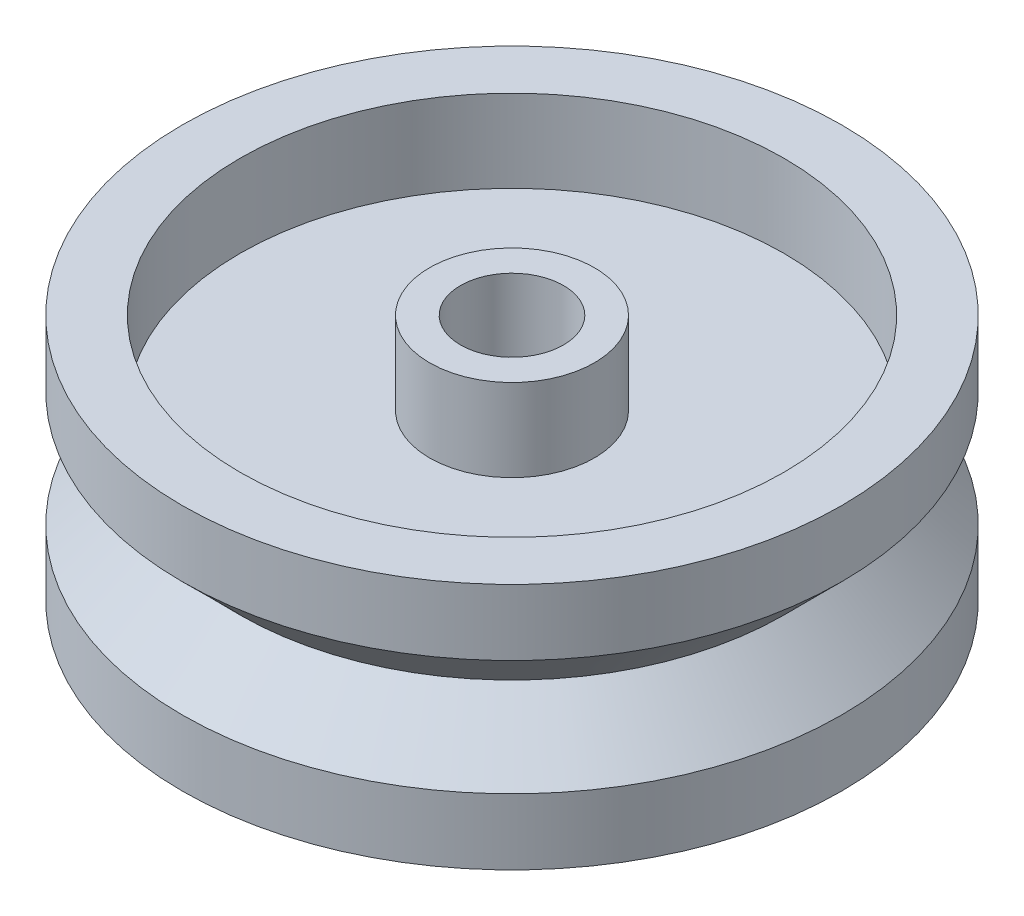
ISO-10303-21;
HEADER;
FILE_DESCRIPTION(('STEP AP214'),'2;1');
FILE_NAME('part.step','',(''),(''),'','','');
FILE_SCHEMA(('AUTOMOTIVE_DESIGN { 1 0 10303 214 1 1 1 1 }'));
ENDSEC;
DATA;
#1=APPLICATION_CONTEXT('core data for automotive mechanical design processes');
#2=APPLICATION_PROTOCOL_DEFINITION('international standard','automotive_design',2000,#1);
#3=PRODUCT_CONTEXT('',#1,'mechanical');
#4=PRODUCT('Part','Part','',(#3));
#5=PRODUCT_RELATED_PRODUCT_CATEGORY('part','',(#4));
#6=PRODUCT_DEFINITION_FORMATION('','',#4);
#7=PRODUCT_DEFINITION_CONTEXT('part definition',#1,'design');
#8=PRODUCT_DEFINITION('design','',#6,#7);
#9=PRODUCT_DEFINITION_SHAPE('','',#8);
#10=(LENGTH_UNIT() NAMED_UNIT(*) SI_UNIT(.MILLI.,.METRE.));
#11=(NAMED_UNIT(*) PLANE_ANGLE_UNIT() SI_UNIT($,.RADIAN.));
#12=(NAMED_UNIT(*) SI_UNIT($,.STERADIAN.) SOLID_ANGLE_UNIT());
#13=UNCERTAINTY_MEASURE_WITH_UNIT(LENGTH_MEASURE(1.E-05),#10,'distance_accuracy_value','');
#14=(GEOMETRIC_REPRESENTATION_CONTEXT(3) GLOBAL_UNCERTAINTY_ASSIGNED_CONTEXT((#13)) GLOBAL_UNIT_ASSIGNED_CONTEXT((#10,
#11,#12)) REPRESENTATION_CONTEXT('',''));
#15=CARTESIAN_POINT('',(0.,0.,0.));
#16=DIRECTION('',(0.,0.,1.));
#17=DIRECTION('',(1.,0.,0.));
#18=AXIS2_PLACEMENT_3D('',#15,#16,#17);
#19=CARTESIAN_POINT('',(0.,-7.5,0.));
#20=DIRECTION('',(0.,1.,0.));
#21=DIRECTION('',(0.,0.,1.));
#22=AXIS2_PLACEMENT_3D('',#19,#20,#21);
#23=CYLINDRICAL_SURFACE('',#22,20.);
#24=CARTESIAN_POINT('',(0.,7.5,0.));
#25=DIRECTION('',(0.,1.,0.));
#26=DIRECTION('',(0.,0.,1.));
#27=AXIS2_PLACEMENT_3D('',#24,#25,#26);
#28=CIRCLE('',#27,20.);
#29=CARTESIAN_POINT('',(0.,7.5,20.));
#30=VERTEX_POINT('',#29);
#31=EDGE_CURVE('E64',#30,#30,#28,.T.);
#32=ORIENTED_EDGE('',*,*,#31,.F.);
#33=EDGE_LOOP('',(#32));
#34=FACE_BOUND('',#33,.T.);
#35=CARTESIAN_POINT('',(0.,3.5,0.));
#36=DIRECTION('',(0.,-1.,0.));
#37=DIRECTION('',(0.,0.,-1.));
#38=AXIS2_PLACEMENT_3D('',#35,#36,#37);
#39=CIRCLE('',#38,20.);
#40=CARTESIAN_POINT('',(0.,3.5,-20.));
#41=VERTEX_POINT('',#40);
#42=EDGE_CURVE('E93',#41,#41,#39,.T.);
#43=ORIENTED_EDGE('',*,*,#42,.F.);
#44=EDGE_LOOP('',(#43));
#45=FACE_BOUND('',#44,.T.);
#46=ADVANCED_FACE('F49',(#34,#45),#23,.T.);
#47=CARTESIAN_POINT('',(0.,-7.5,0.));
#48=DIRECTION('',(0.,1.,0.));
#49=DIRECTION('',(0.,0.,1.));
#50=AXIS2_PLACEMENT_3D('',#47,#48,#49);
#51=CIRCLE('',#50,20.);
#52=CARTESIAN_POINT('',(0.,-7.5,20.));
#53=VERTEX_POINT('',#52);
#54=EDGE_CURVE('E56',#53,#53,#51,.T.);
#55=ORIENTED_EDGE('',*,*,#54,.T.);
#56=EDGE_LOOP('',(#55));
#57=FACE_BOUND('',#56,.T.);
#58=CARTESIAN_POINT('',(0.,-3.5,0.));
#59=DIRECTION('',(0.,-1.,0.));
#60=DIRECTION('',(0.,0.,-1.));
#61=AXIS2_PLACEMENT_3D('',#58,#59,#60);
#62=CIRCLE('',#61,20.);
#63=CARTESIAN_POINT('',(0.,-3.5,-20.));
#64=VERTEX_POINT('',#63);
#65=EDGE_CURVE('E99',#64,#64,#62,.T.);
#66=ORIENTED_EDGE('',*,*,#65,.T.);
#67=EDGE_LOOP('',(#66));
#68=FACE_BOUND('',#67,.T.);
#69=ADVANCED_FACE('F103',(#57,#68),#23,.T.);
#70=CARTESIAN_POINT('',(0.,-7.5,0.));
#71=DIRECTION('',(0.,1.,0.));
#72=DIRECTION('',(0.,0.,1.));
#73=AXIS2_PLACEMENT_3D('',#70,#71,#72);
#74=CYLINDRICAL_SURFACE('',#73,16.5);
#75=CARTESIAN_POINT('',(0.,-7.5,0.));
#76=DIRECTION('',(0.,1.,0.));
#77=DIRECTION('',(0.,0.,1.));
#78=AXIS2_PLACEMENT_3D('',#75,#76,#77);
#79=CIRCLE('',#78,16.5);
#80=CARTESIAN_POINT('',(0.,-7.5,16.5));
#81=VERTEX_POINT('',#80);
#82=EDGE_CURVE('E60',#81,#81,#79,.T.);
#83=ORIENTED_EDGE('',*,*,#82,.F.);
#84=EDGE_LOOP('',(#83));
#85=FACE_BOUND('',#84,.T.);
#86=CARTESIAN_POINT('',(0.,-2.5,0.));
#87=DIRECTION('',(0.,1.,0.));
#88=DIRECTION('',(0.,0.,1.));
#89=AXIS2_PLACEMENT_3D('',#86,#87,#88);
#90=CIRCLE('',#89,16.5);
#91=CARTESIAN_POINT('',(0.,-2.5,16.5));
#92=VERTEX_POINT('',#91);
#93=EDGE_CURVE('E11',#92,#92,#90,.F.);
#94=ORIENTED_EDGE('',*,*,#93,.F.);
#95=EDGE_LOOP('',(#94));
#96=FACE_BOUND('',#95,.T.);
#97=ADVANCED_FACE('F122',(#85,#96),#74,.F.);
#98=CARTESIAN_POINT('',(0.,2.5,0.));
#99=DIRECTION('',(0.,1.,0.));
#100=DIRECTION('',(0.,0.,1.));
#101=AXIS2_PLACEMENT_3D('',#98,#99,#100);
#102=CIRCLE('',#101,16.5);
#103=CARTESIAN_POINT('',(0.,2.5,16.5));
#104=VERTEX_POINT('',#103);
#105=EDGE_CURVE('E72',#104,#104,#102,.T.);
#106=ORIENTED_EDGE('',*,*,#105,.F.);
#107=EDGE_LOOP('',(#106));
#108=FACE_BOUND('',#107,.T.);
#109=CARTESIAN_POINT('',(0.,7.5,0.));
#110=DIRECTION('',(0.,1.,0.));
#111=DIRECTION('',(0.,0.,1.));
#112=AXIS2_PLACEMENT_3D('',#109,#110,#111);
#113=CIRCLE('',#112,16.5);
#114=CARTESIAN_POINT('',(0.,7.5,16.5));
#115=VERTEX_POINT('',#114);
#116=EDGE_CURVE('E69',#115,#115,#113,.T.);
#117=ORIENTED_EDGE('',*,*,#116,.T.);
#118=EDGE_LOOP('',(#117));
#119=FACE_BOUND('',#118,.T.);
#120=ADVANCED_FACE('F51',(#108,#119),#74,.F.);
#121=CARTESIAN_POINT('',(0.,-7.5,0.));
#122=DIRECTION('',(0.,1.,0.));
#123=DIRECTION('',(0.,0.,1.));
#124=AXIS2_PLACEMENT_3D('',#121,#122,#123);
#125=PLANE('',#124);
#126=ORIENTED_EDGE('',*,*,#82,.T.);
#127=EDGE_LOOP('',(#126));
#128=FACE_BOUND('',#127,.T.);
#129=ORIENTED_EDGE('',*,*,#54,.F.);
#130=EDGE_LOOP('',(#129));
#131=FACE_BOUND('',#130,.T.);
#132=ADVANCED_FACE('F126',(#128,#131),#125,.F.);
#133=CARTESIAN_POINT('',(0.,7.5,0.));
#134=DIRECTION('',(0.,1.,0.));
#135=DIRECTION('',(0.,0.,1.));
#136=AXIS2_PLACEMENT_3D('',#133,#134,#135);
#137=PLANE('',#136);
#138=ORIENTED_EDGE('',*,*,#116,.F.);
#139=EDGE_LOOP('',(#138));
#140=FACE_BOUND('',#139,.T.);
#141=ORIENTED_EDGE('',*,*,#31,.T.);
#142=EDGE_LOOP('',(#141));
#143=FACE_BOUND('',#142,.T.);
#144=ADVANCED_FACE('F129',(#140,#143),#137,.T.);
#145=CARTESIAN_POINT('',(0.,-2.5,0.));
#146=DIRECTION('',(0.,1.,0.));
#147=DIRECTION('',(0.,0.,1.));
#148=AXIS2_PLACEMENT_3D('',#145,#146,#147);
#149=PLANE('',#148);
#150=CARTESIAN_POINT('',(0.,-2.5,0.));
#151=DIRECTION('',(0.,1.,0.));
#152=DIRECTION('',(0.,0.,1.));
#153=AXIS2_PLACEMENT_3D('',#150,#151,#152);
#154=CIRCLE('',#153,5.);
#155=CARTESIAN_POINT('',(0.,-2.5,5.));
#156=VERTEX_POINT('',#155);
#157=EDGE_CURVE('E78',#156,#156,#154,.T.);
#158=ORIENTED_EDGE('',*,*,#157,.T.);
#159=EDGE_LOOP('',(#158));
#160=FACE_BOUND('',#159,.T.);
#161=ORIENTED_EDGE('',*,*,#93,.T.);
#162=EDGE_LOOP('',(#161));
#163=FACE_BOUND('',#162,.T.);
#164=ADVANCED_FACE('F133',(#160,#163),#149,.F.);
#165=CARTESIAN_POINT('',(0.,2.5,0.));
#166=DIRECTION('',(0.,1.,0.));
#167=DIRECTION('',(0.,0.,1.));
#168=AXIS2_PLACEMENT_3D('',#165,#166,#167);
#169=PLANE('',#168);
#170=CARTESIAN_POINT('',(0.,2.5,0.));
#171=DIRECTION('',(0.,1.,0.));
#172=DIRECTION('',(0.,0.,1.));
#173=AXIS2_PLACEMENT_3D('',#170,#171,#172);
#174=CIRCLE('',#173,5.);
#175=CARTESIAN_POINT('',(0.,2.5,5.));
#176=VERTEX_POINT('',#175);
#177=EDGE_CURVE('E75',#176,#176,#174,.T.);
#178=ORIENTED_EDGE('',*,*,#177,.F.);
#179=EDGE_LOOP('',(#178));
#180=FACE_BOUND('',#179,.T.);
#181=ORIENTED_EDGE('',*,*,#105,.T.);
#182=EDGE_LOOP('',(#181));
#183=FACE_BOUND('',#182,.T.);
#184=ADVANCED_FACE('F137',(#180,#183),#169,.T.);
#185=CARTESIAN_POINT('',(0.,-7.5,0.));
#186=DIRECTION('',(0.,1.,0.));
#187=DIRECTION('',(0.,0.,1.));
#188=AXIS2_PLACEMENT_3D('',#185,#186,#187);
#189=CYLINDRICAL_SURFACE('',#188,5.);
#190=CARTESIAN_POINT('',(0.,-7.5,0.));
#191=DIRECTION('',(0.,1.,0.));
#192=DIRECTION('',(0.,0.,1.));
#193=AXIS2_PLACEMENT_3D('',#190,#191,#192);
#194=CIRCLE('',#193,5.);
#195=CARTESIAN_POINT('',(0.,-7.5,5.));
#196=VERTEX_POINT('',#195);
#197=EDGE_CURVE('E81',#196,#196,#194,.T.);
#198=ORIENTED_EDGE('',*,*,#197,.T.);
#199=EDGE_LOOP('',(#198));
#200=FACE_BOUND('',#199,.T.);
#201=ORIENTED_EDGE('',*,*,#157,.F.);
#202=EDGE_LOOP('',(#201));
#203=FACE_BOUND('',#202,.T.);
#204=ADVANCED_FACE('F141',(#200,#203),#189,.T.);
#205=CARTESIAN_POINT('',(0.,-7.5,0.));
#206=DIRECTION('',(0.,1.,0.));
#207=DIRECTION('',(0.,0.,1.));
#208=AXIS2_PLACEMENT_3D('',#205,#206,#207);
#209=CYLINDRICAL_SURFACE('',#208,3.125);
#210=CARTESIAN_POINT('',(0.,-7.5,0.));
#211=DIRECTION('',(0.,1.,0.));
#212=DIRECTION('',(0.,0.,1.));
#213=AXIS2_PLACEMENT_3D('',#210,#211,#212);
#214=CIRCLE('',#213,3.125);
#215=CARTESIAN_POINT('',(0.,-7.5,3.125));
#216=VERTEX_POINT('',#215);
#217=EDGE_CURVE('E84',#216,#216,#214,.T.);
#218=ORIENTED_EDGE('',*,*,#217,.F.);
#219=EDGE_LOOP('',(#218));
#220=FACE_BOUND('',#219,.T.);
#221=CARTESIAN_POINT('',(0.,7.5,0.));
#222=DIRECTION('',(0.,1.,0.));
#223=DIRECTION('',(0.,0.,1.));
#224=AXIS2_PLACEMENT_3D('',#221,#222,#223);
#225=CIRCLE('',#224,3.125);
#226=CARTESIAN_POINT('',(0.,7.5,3.125));
#227=VERTEX_POINT('',#226);
#228=EDGE_CURVE('E90',#227,#227,#225,.T.);
#229=ORIENTED_EDGE('',*,*,#228,.T.);
#230=EDGE_LOOP('',(#229));
#231=FACE_BOUND('',#230,.T.);
#232=ADVANCED_FACE('F143',(#220,#231),#209,.F.);
#233=ORIENTED_EDGE('',*,*,#177,.T.);
#234=EDGE_LOOP('',(#233));
#235=FACE_BOUND('',#234,.T.);
#236=CARTESIAN_POINT('',(0.,7.5,0.));
#237=DIRECTION('',(0.,1.,0.));
#238=DIRECTION('',(0.,0.,1.));
#239=AXIS2_PLACEMENT_3D('',#236,#237,#238);
#240=CIRCLE('',#239,5.);
#241=CARTESIAN_POINT('',(0.,7.5,5.));
#242=VERTEX_POINT('',#241);
#243=EDGE_CURVE('E87',#242,#242,#240,.T.);
#244=ORIENTED_EDGE('',*,*,#243,.F.);
#245=EDGE_LOOP('',(#244));
#246=FACE_BOUND('',#245,.T.);
#247=ADVANCED_FACE('F146',(#235,#246),#189,.T.);
#248=CARTESIAN_POINT('',(0.,-7.5,0.));
#249=DIRECTION('',(0.,1.,0.));
#250=DIRECTION('',(0.,0.,1.));
#251=AXIS2_PLACEMENT_3D('',#248,#249,#250);
#252=PLANE('',#251);
#253=ORIENTED_EDGE('',*,*,#217,.T.);
#254=EDGE_LOOP('',(#253));
#255=FACE_BOUND('',#254,.T.);
#256=ORIENTED_EDGE('',*,*,#197,.F.);
#257=EDGE_LOOP('',(#256));
#258=FACE_BOUND('',#257,.T.);
#259=ADVANCED_FACE('F150',(#255,#258),#252,.F.);
#260=CARTESIAN_POINT('',(0.,7.5,0.));
#261=DIRECTION('',(0.,1.,0.));
#262=DIRECTION('',(0.,0.,1.));
#263=AXIS2_PLACEMENT_3D('',#260,#261,#262);
#264=PLANE('',#263);
#265=ORIENTED_EDGE('',*,*,#228,.F.);
#266=EDGE_LOOP('',(#265));
#267=FACE_BOUND('',#266,.T.);
#268=ORIENTED_EDGE('',*,*,#243,.T.);
#269=EDGE_LOOP('',(#268));
#270=FACE_BOUND('',#269,.T.);
#271=ADVANCED_FACE('F113',(#267,#270),#264,.T.);
#272=CARTESIAN_POINT('',(0.,0.,0.));
#273=DIRECTION('',(0.,1.,0.));
#274=DIRECTION('',(0.,0.,1.));
#275=AXIS2_PLACEMENT_3D('',#272,#273,#274);
#276=CONICAL_SURFACE('',#275,16.5,0.78539816339745);
#277=ORIENTED_EDGE('',*,*,#42,.T.);
#278=EDGE_LOOP('',(#277));
#279=FACE_BOUND('',#278,.T.);
#280=CARTESIAN_POINT('',(0.,0.,0.));
#281=DIRECTION('',(0.,-1.,0.));
#282=DIRECTION('',(0.,0.,-1.));
#283=AXIS2_PLACEMENT_3D('',#280,#281,#282);
#284=CIRCLE('',#283,16.5);
#285=CARTESIAN_POINT('',(0.,0.,-16.5));
#286=VERTEX_POINT('',#285);
#287=EDGE_CURVE('E96',#286,#286,#284,.T.);
#288=ORIENTED_EDGE('',*,*,#287,.F.);
#289=EDGE_LOOP('',(#288));
#290=FACE_BOUND('',#289,.T.);
#291=ADVANCED_FACE('F107',(#279,#290),#276,.T.);
#292=CARTESIAN_POINT('',(0.,-3.5,0.));
#293=DIRECTION('',(0.,-1.,0.));
#294=DIRECTION('',(0.,0.,-1.));
#295=AXIS2_PLACEMENT_3D('',#292,#293,#294);
#296=CONICAL_SURFACE('',#295,20.,0.78539816339745);
#297=ORIENTED_EDGE('',*,*,#287,.T.);
#298=EDGE_LOOP('',(#297));
#299=FACE_BOUND('',#298,.T.);
#300=ORIENTED_EDGE('',*,*,#65,.F.);
#301=EDGE_LOOP('',(#300));
#302=FACE_BOUND('',#301,.T.);
#303=ADVANCED_FACE('F105',(#299,#302),#296,.T.);
#304=CLOSED_SHELL('',(#46,#69,#97,#120,#132,#144,#164,#184,#204,#232,#247,#259,#271,#291,#303));
#305=MANIFOLD_SOLID_BREP('B2',#304);
#306=ADVANCED_BREP_SHAPE_REPRESENTATION('',(#18,#305),#14);
#307=SHAPE_DEFINITION_REPRESENTATION(#9,#306);
ENDSEC;
END-ISO-10303-21;
